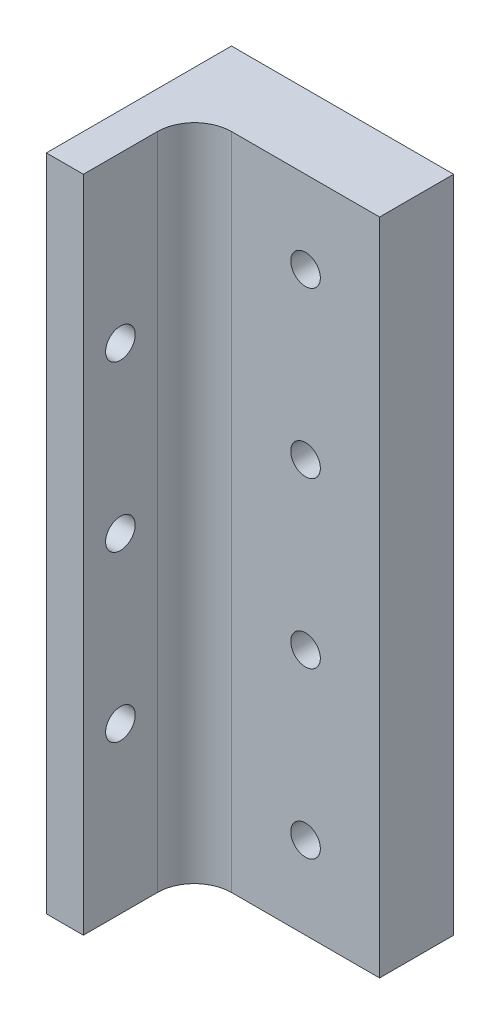
ISO-10303-21;
HEADER;
FILE_DESCRIPTION(('STEP AP214'),'2;1');
FILE_NAME('part.step','',(''),(''),'','','');
FILE_SCHEMA(('AUTOMOTIVE_DESIGN { 1 0 10303 214 1 1 1 1 }'));
ENDSEC;
DATA;
#1=APPLICATION_CONTEXT('core data for automotive mechanical design processes');
#2=APPLICATION_PROTOCOL_DEFINITION('international standard','automotive_design',2000,#1);
#3=PRODUCT_CONTEXT('',#1,'mechanical');
#4=PRODUCT('Part','Part','',(#3));
#5=PRODUCT_RELATED_PRODUCT_CATEGORY('part','',(#4));
#6=PRODUCT_DEFINITION_FORMATION('','',#4);
#7=PRODUCT_DEFINITION_CONTEXT('part definition',#1,'design');
#8=PRODUCT_DEFINITION('design','',#6,#7);
#9=PRODUCT_DEFINITION_SHAPE('','',#8);
#10=(LENGTH_UNIT() NAMED_UNIT(*) SI_UNIT(.MILLI.,.METRE.));
#11=(NAMED_UNIT(*) PLANE_ANGLE_UNIT() SI_UNIT($,.RADIAN.));
#12=(NAMED_UNIT(*) SI_UNIT($,.STERADIAN.) SOLID_ANGLE_UNIT());
#13=UNCERTAINTY_MEASURE_WITH_UNIT(LENGTH_MEASURE(1.E-05),#10,'distance_accuracy_value','');
#14=(GEOMETRIC_REPRESENTATION_CONTEXT(3) GLOBAL_UNCERTAINTY_ASSIGNED_CONTEXT((#13)) GLOBAL_UNIT_ASSIGNED_CONTEXT((#10,
#11,#12)) REPRESENTATION_CONTEXT('',''));
#15=CARTESIAN_POINT('',(0.,0.,0.));
#16=DIRECTION('',(0.,0.,1.));
#17=DIRECTION('',(1.,0.,0.));
#18=AXIS2_PLACEMENT_3D('',#15,#16,#17);
#19=CARTESIAN_POINT('',(0.,0.,10.));
#20=DIRECTION('',(0.,0.,1.));
#21=DIRECTION('',(1.,0.,0.));
#22=AXIS2_PLACEMENT_3D('',#19,#20,#21);
#23=PLANE('',#22);
#24=DIRECTION('',(0.,-1.,0.));
#25=VECTOR('',#24,1.);
#26=CARTESIAN_POINT('',(-55.,-57.,10.));
#27=LINE('',#26,#25);
#28=CARTESIAN_POINT('',(-55.,32.,10.));
#29=VERTEX_POINT('',#28);
#30=CARTESIAN_POINT('',(-55.,-57.,10.));
#31=VERTEX_POINT('',#30);
#32=EDGE_CURVE('E52',#29,#31,#27,.T.);
#33=ORIENTED_EDGE('',*,*,#32,.F.);
#34=DIRECTION('',(1.,0.,0.));
#35=VECTOR('',#34,1.);
#36=CARTESIAN_POINT('',(-55.,32.,10.));
#37=LINE('',#36,#35);
#38=CARTESIAN_POINT('',(-75.,32.,10.));
#39=VERTEX_POINT('',#38);
#40=EDGE_CURVE('E105',#39,#29,#37,.T.);
#41=ORIENTED_EDGE('',*,*,#40,.F.);
#42=DIRECTION('',(0.,1.,0.));
#43=VECTOR('',#42,1.);
#44=CARTESIAN_POINT('',(-75.,0.,10.));
#45=LINE('',#44,#43);
#46=CARTESIAN_POINT('',(-75.,-57.,10.));
#47=VERTEX_POINT('',#46);
#48=EDGE_CURVE('E114',#39,#47,#45,.F.);
#49=ORIENTED_EDGE('',*,*,#48,.T.);
#50=DIRECTION('',(-1.,0.,0.));
#51=VECTOR('',#50,1.);
#52=CARTESIAN_POINT('',(-55.,-57.,10.));
#53=LINE('',#52,#51);
#54=EDGE_CURVE('E116',#31,#47,#53,.T.);
#55=ORIENTED_EDGE('',*,*,#54,.F.);
#56=EDGE_LOOP('',(#33,#41,#49,#55));
#57=FACE_BOUND('',#56,.T.);
#58=CARTESIAN_POINT('',(-65.,20.875,10.));
#59=DIRECTION('',(0.,0.,1.));
#60=DIRECTION('',(1.,0.,0.));
#61=AXIS2_PLACEMENT_3D('',#58,#59,#60);
#62=CIRCLE('',#61,2.);
#63=CARTESIAN_POINT('',(-63.,20.875,10.));
#64=VERTEX_POINT('',#63);
#65=EDGE_CURVE('E203',#64,#64,#62,.T.);
#66=ORIENTED_EDGE('',*,*,#65,.F.);
#67=EDGE_LOOP('',(#66));
#68=FACE_BOUND('',#67,.T.);
#69=CARTESIAN_POINT('',(-65.,-1.375,10.));
#70=DIRECTION('',(0.,0.,1.));
#71=DIRECTION('',(1.,0.,0.));
#72=AXIS2_PLACEMENT_3D('',#69,#70,#71);
#73=CIRCLE('',#72,2.);
#74=CARTESIAN_POINT('',(-63.,-1.375,10.));
#75=VERTEX_POINT('',#74);
#76=EDGE_CURVE('E197',#75,#75,#73,.T.);
#77=ORIENTED_EDGE('',*,*,#76,.F.);
#78=EDGE_LOOP('',(#77));
#79=FACE_BOUND('',#78,.T.);
#80=CARTESIAN_POINT('',(-65.,-23.625,10.));
#81=DIRECTION('',(0.,0.,1.));
#82=DIRECTION('',(1.,0.,0.));
#83=AXIS2_PLACEMENT_3D('',#80,#81,#82);
#84=CIRCLE('',#83,2.);
#85=CARTESIAN_POINT('',(-63.,-23.625,10.));
#86=VERTEX_POINT('',#85);
#87=EDGE_CURVE('E191',#86,#86,#84,.T.);
#88=ORIENTED_EDGE('',*,*,#87,.F.);
#89=EDGE_LOOP('',(#88));
#90=FACE_BOUND('',#89,.T.);
#91=CARTESIAN_POINT('',(-65.,-45.875,10.));
#92=DIRECTION('',(0.,0.,1.));
#93=DIRECTION('',(1.,0.,0.));
#94=AXIS2_PLACEMENT_3D('',#91,#92,#93);
#95=CIRCLE('',#94,2.);
#96=CARTESIAN_POINT('',(-63.,-45.875,10.));
#97=VERTEX_POINT('',#96);
#98=EDGE_CURVE('E185',#97,#97,#95,.T.);
#99=ORIENTED_EDGE('',*,*,#98,.F.);
#100=EDGE_LOOP('',(#99));
#101=FACE_BOUND('',#100,.T.);
#102=ADVANCED_FACE('F37',(#57,#68,#79,#90,#101),#23,.T.);
#103=CARTESIAN_POINT('',(0.,0.,0.));
#104=DIRECTION('',(0.,0.,1.));
#105=DIRECTION('',(1.,0.,0.));
#106=AXIS2_PLACEMENT_3D('',#103,#104,#105);
#107=PLANE('',#106);
#108=CARTESIAN_POINT('',(-65.,20.875,0.));
#109=DIRECTION('',(0.,0.,1.));
#110=DIRECTION('',(1.,0.,0.));
#111=AXIS2_PLACEMENT_3D('',#108,#109,#110);
#112=CIRCLE('',#111,2.);
#113=CARTESIAN_POINT('',(-63.,20.875,0.));
#114=VERTEX_POINT('',#113);
#115=EDGE_CURVE('E171',#114,#114,#112,.T.);
#116=ORIENTED_EDGE('',*,*,#115,.T.);
#117=EDGE_LOOP('',(#116));
#118=FACE_BOUND('',#117,.T.);
#119=CARTESIAN_POINT('',(-65.,-1.375,0.));
#120=DIRECTION('',(0.,0.,1.));
#121=DIRECTION('',(1.,0.,0.));
#122=AXIS2_PLACEMENT_3D('',#119,#120,#121);
#123=CIRCLE('',#122,2.);
#124=CARTESIAN_POINT('',(-63.,-1.375,0.));
#125=VERTEX_POINT('',#124);
#126=EDGE_CURVE('E200',#125,#125,#123,.T.);
#127=ORIENTED_EDGE('',*,*,#126,.T.);
#128=EDGE_LOOP('',(#127));
#129=FACE_BOUND('',#128,.T.);
#130=CARTESIAN_POINT('',(-65.,-23.625,0.));
#131=DIRECTION('',(0.,0.,1.));
#132=DIRECTION('',(1.,0.,0.));
#133=AXIS2_PLACEMENT_3D('',#130,#131,#132);
#134=CIRCLE('',#133,2.);
#135=CARTESIAN_POINT('',(-63.,-23.625,0.));
#136=VERTEX_POINT('',#135);
#137=EDGE_CURVE('E194',#136,#136,#134,.T.);
#138=ORIENTED_EDGE('',*,*,#137,.T.);
#139=EDGE_LOOP('',(#138));
#140=FACE_BOUND('',#139,.T.);
#141=CARTESIAN_POINT('',(-65.,-45.875,0.));
#142=DIRECTION('',(0.,0.,1.));
#143=DIRECTION('',(1.,0.,0.));
#144=AXIS2_PLACEMENT_3D('',#141,#142,#143);
#145=CIRCLE('',#144,2.);
#146=CARTESIAN_POINT('',(-63.,-45.875,0.));
#147=VERTEX_POINT('',#146);
#148=EDGE_CURVE('E188',#147,#147,#145,.T.);
#149=ORIENTED_EDGE('',*,*,#148,.T.);
#150=EDGE_LOOP('',(#149));
#151=FACE_BOUND('',#150,.T.);
#152=DIRECTION('',(-1.,0.,0.));
#153=VECTOR('',#152,1.);
#154=CARTESIAN_POINT('',(-55.,32.,0.));
#155=LINE('',#154,#153);
#156=CARTESIAN_POINT('',(-55.,32.,0.));
#157=VERTEX_POINT('',#156);
#158=CARTESIAN_POINT('',(-85.,32.,0.));
#159=VERTEX_POINT('',#158);
#160=EDGE_CURVE('E103',#157,#159,#155,.T.);
#161=ORIENTED_EDGE('',*,*,#160,.F.);
#162=DIRECTION('',(0.,-1.,0.));
#163=VECTOR('',#162,1.);
#164=CARTESIAN_POINT('',(-55.,-57.,0.));
#165=LINE('',#164,#163);
#166=CARTESIAN_POINT('',(-55.,-57.,0.));
#167=VERTEX_POINT('',#166);
#168=EDGE_CURVE('E93',#157,#167,#165,.T.);
#169=ORIENTED_EDGE('',*,*,#168,.T.);
#170=DIRECTION('',(1.,0.,0.));
#171=VECTOR('',#170,1.);
#172=CARTESIAN_POINT('',(-55.,-57.,0.));
#173=LINE('',#172,#171);
#174=CARTESIAN_POINT('',(-85.,-57.,0.));
#175=VERTEX_POINT('',#174);
#176=EDGE_CURVE('E150',#175,#167,#173,.T.);
#177=ORIENTED_EDGE('',*,*,#176,.F.);
#178=DIRECTION('',(0.,-1.,0.));
#179=VECTOR('',#178,1.);
#180=CARTESIAN_POINT('',(-85.,32.,0.));
#181=LINE('',#180,#179);
#182=EDGE_CURVE('E110',#159,#175,#181,.T.);
#183=ORIENTED_EDGE('',*,*,#182,.F.);
#184=EDGE_LOOP('',(#161,#169,#177,#183));
#185=FACE_BOUND('',#184,.T.);
#186=ADVANCED_FACE('F108',(#118,#129,#140,#151,#185),#107,.F.);
#187=CARTESIAN_POINT('',(0.,32.,0.));
#188=DIRECTION('',(0.,-1.,0.));
#189=DIRECTION('',(0.,0.,-1.));
#190=AXIS2_PLACEMENT_3D('',#187,#188,#189);
#191=PLANE('',#190);
#192=ORIENTED_EDGE('',*,*,#40,.T.);
#193=DIRECTION('',(0.,0.,1.));
#194=VECTOR('',#193,1.);
#195=CARTESIAN_POINT('',(-55.,32.,0.));
#196=LINE('',#195,#194);
#197=EDGE_CURVE('E96',#157,#29,#196,.T.);
#198=ORIENTED_EDGE('',*,*,#197,.F.);
#199=ORIENTED_EDGE('',*,*,#160,.T.);
#200=DIRECTION('',(0.,0.,-1.));
#201=VECTOR('',#200,1.);
#202=CARTESIAN_POINT('',(-85.,32.,0.));
#203=LINE('',#202,#201);
#204=CARTESIAN_POINT('',(-85.,32.,25.));
#205=VERTEX_POINT('',#204);
#206=EDGE_CURVE('E148',#205,#159,#203,.T.);
#207=ORIENTED_EDGE('',*,*,#206,.F.);
#208=DIRECTION('',(-1.,0.,0.));
#209=VECTOR('',#208,1.);
#210=CARTESIAN_POINT('',(-85.,32.,25.));
#211=LINE('',#210,#209);
#212=CARTESIAN_POINT('',(-80.,32.,25.));
#213=VERTEX_POINT('',#212);
#214=EDGE_CURVE('E143',#213,#205,#211,.T.);
#215=ORIENTED_EDGE('',*,*,#214,.F.);
#216=DIRECTION('',(0.,0.,-1.));
#217=VECTOR('',#216,1.);
#218=CARTESIAN_POINT('',(-80.,32.,25.));
#219=LINE('',#218,#217);
#220=CARTESIAN_POINT('',(-80.,32.,15.));
#221=VERTEX_POINT('',#220);
#222=EDGE_CURVE('E139',#213,#221,#219,.T.);
#223=ORIENTED_EDGE('',*,*,#222,.T.);
#224=CARTESIAN_POINT('',(-75.,32.,15.));
#225=DIRECTION('',(0.,-1.,0.));
#226=DIRECTION('',(0.,0.,-1.));
#227=AXIS2_PLACEMENT_3D('',#224,#225,#226);
#228=CIRCLE('',#227,5.);
#229=EDGE_CURVE('E45',#221,#39,#228,.T.);
#230=ORIENTED_EDGE('',*,*,#229,.T.);
#231=EDGE_LOOP('',(#192,#198,#199,#207,#215,#223,#230));
#232=FACE_BOUND('',#231,.T.);
#233=ADVANCED_FACE('F102',(#232),#191,.F.);
#234=CARTESIAN_POINT('',(0.,-57.,0.));
#235=DIRECTION('',(0.,1.,0.));
#236=DIRECTION('',(0.,0.,1.));
#237=AXIS2_PLACEMENT_3D('',#234,#235,#236);
#238=PLANE('',#237);
#239=ORIENTED_EDGE('',*,*,#176,.T.);
#240=DIRECTION('',(0.,0.,1.));
#241=VECTOR('',#240,1.);
#242=CARTESIAN_POINT('',(-55.,-57.,0.));
#243=LINE('',#242,#241);
#244=EDGE_CURVE('E97',#167,#31,#243,.T.);
#245=ORIENTED_EDGE('',*,*,#244,.T.);
#246=ORIENTED_EDGE('',*,*,#54,.T.);
#247=CARTESIAN_POINT('',(-75.,-57.,15.));
#248=DIRECTION('',(0.,1.,0.));
#249=DIRECTION('',(0.,0.,1.));
#250=AXIS2_PLACEMENT_3D('',#247,#248,#249);
#251=CIRCLE('',#250,5.);
#252=CARTESIAN_POINT('',(-80.,-57.,15.));
#253=VERTEX_POINT('',#252);
#254=EDGE_CURVE('E11',#47,#253,#251,.T.);
#255=ORIENTED_EDGE('',*,*,#254,.T.);
#256=DIRECTION('',(0.,0.,-1.));
#257=VECTOR('',#256,1.);
#258=CARTESIAN_POINT('',(-80.,-57.,25.));
#259=LINE('',#258,#257);
#260=CARTESIAN_POINT('',(-80.,-57.,25.));
#261=VERTEX_POINT('',#260);
#262=EDGE_CURVE('E133',#261,#253,#259,.T.);
#263=ORIENTED_EDGE('',*,*,#262,.F.);
#264=DIRECTION('',(1.,0.,0.));
#265=VECTOR('',#264,1.);
#266=CARTESIAN_POINT('',(-85.,-57.,25.));
#267=LINE('',#266,#265);
#268=CARTESIAN_POINT('',(-85.,-57.,25.));
#269=VERTEX_POINT('',#268);
#270=EDGE_CURVE('E152',#269,#261,#267,.T.);
#271=ORIENTED_EDGE('',*,*,#270,.F.);
#272=DIRECTION('',(0.,0.,1.));
#273=VECTOR('',#272,1.);
#274=CARTESIAN_POINT('',(-85.,-57.,0.));
#275=LINE('',#274,#273);
#276=EDGE_CURVE('E141',#175,#269,#275,.T.);
#277=ORIENTED_EDGE('',*,*,#276,.F.);
#278=EDGE_LOOP('',(#239,#245,#246,#255,#263,#271,#277));
#279=FACE_BOUND('',#278,.T.);
#280=ADVANCED_FACE('F131',(#279),#238,.F.);
#281=CARTESIAN_POINT('',(-85.,0.,0.));
#282=DIRECTION('',(-1.,0.,0.));
#283=DIRECTION('',(0.,0.,1.));
#284=AXIS2_PLACEMENT_3D('',#281,#282,#283);
#285=PLANE('',#284);
#286=CARTESIAN_POINT('',(-85.,9.75,20.));
#287=DIRECTION('',(1.,0.,0.));
#288=DIRECTION('',(0.,1.,0.));
#289=AXIS2_PLACEMENT_3D('',#286,#287,#288);
#290=CIRCLE('',#289,2.);
#291=CARTESIAN_POINT('',(-85.,11.75,20.));
#292=VERTEX_POINT('',#291);
#293=EDGE_CURVE('E166',#292,#292,#290,.T.);
#294=ORIENTED_EDGE('',*,*,#293,.T.);
#295=EDGE_LOOP('',(#294));
#296=FACE_BOUND('',#295,.T.);
#297=CARTESIAN_POINT('',(-85.,-12.5,20.));
#298=DIRECTION('',(1.,0.,0.));
#299=DIRECTION('',(0.,1.,0.));
#300=AXIS2_PLACEMENT_3D('',#297,#298,#299);
#301=CIRCLE('',#300,2.);
#302=CARTESIAN_POINT('',(-85.,-10.5,20.));
#303=VERTEX_POINT('',#302);
#304=EDGE_CURVE('E177',#303,#303,#301,.T.);
#305=ORIENTED_EDGE('',*,*,#304,.T.);
#306=EDGE_LOOP('',(#305));
#307=FACE_BOUND('',#306,.T.);
#308=CARTESIAN_POINT('',(-85.,-34.75,20.));
#309=DIRECTION('',(1.,0.,0.));
#310=DIRECTION('',(0.,1.,0.));
#311=AXIS2_PLACEMENT_3D('',#308,#309,#310);
#312=CIRCLE('',#311,2.);
#313=CARTESIAN_POINT('',(-85.,-32.75,20.));
#314=VERTEX_POINT('',#313);
#315=EDGE_CURVE('E170',#314,#314,#312,.T.);
#316=ORIENTED_EDGE('',*,*,#315,.T.);
#317=EDGE_LOOP('',(#316));
#318=FACE_BOUND('',#317,.T.);
#319=ORIENTED_EDGE('',*,*,#182,.T.);
#320=ORIENTED_EDGE('',*,*,#276,.T.);
#321=DIRECTION('',(0.,-1.,0.));
#322=VECTOR('',#321,1.);
#323=CARTESIAN_POINT('',(-85.,32.,25.));
#324=LINE('',#323,#322);
#325=EDGE_CURVE('E157',#205,#269,#324,.T.);
#326=ORIENTED_EDGE('',*,*,#325,.F.);
#327=ORIENTED_EDGE('',*,*,#206,.T.);
#328=EDGE_LOOP('',(#319,#320,#326,#327));
#329=FACE_BOUND('',#328,.T.);
#330=ADVANCED_FACE('F156',(#296,#307,#318,#329),#285,.T.);
#331=CARTESIAN_POINT('',(-80.,32.,25.));
#332=DIRECTION('',(-1.,0.,0.));
#333=DIRECTION('',(0.,-1.,0.));
#334=AXIS2_PLACEMENT_3D('',#331,#332,#333);
#335=PLANE('',#334);
#336=CARTESIAN_POINT('',(-80.,9.75,20.));
#337=DIRECTION('',(1.,0.,0.));
#338=DIRECTION('',(0.,1.,0.));
#339=AXIS2_PLACEMENT_3D('',#336,#337,#338);
#340=CIRCLE('',#339,2.);
#341=CARTESIAN_POINT('',(-80.,11.75,20.));
#342=VERTEX_POINT('',#341);
#343=EDGE_CURVE('E180',#342,#342,#340,.T.);
#344=ORIENTED_EDGE('',*,*,#343,.F.);
#345=EDGE_LOOP('',(#344));
#346=FACE_BOUND('',#345,.T.);
#347=CARTESIAN_POINT('',(-80.,-12.5,20.));
#348=DIRECTION('',(1.,0.,0.));
#349=DIRECTION('',(0.,1.,0.));
#350=AXIS2_PLACEMENT_3D('',#347,#348,#349);
#351=CIRCLE('',#350,2.);
#352=CARTESIAN_POINT('',(-80.,-10.5,20.));
#353=VERTEX_POINT('',#352);
#354=EDGE_CURVE('E174',#353,#353,#351,.T.);
#355=ORIENTED_EDGE('',*,*,#354,.F.);
#356=EDGE_LOOP('',(#355));
#357=FACE_BOUND('',#356,.T.);
#358=CARTESIAN_POINT('',(-80.,-34.75,20.));
#359=DIRECTION('',(1.,0.,0.));
#360=DIRECTION('',(0.,1.,0.));
#361=AXIS2_PLACEMENT_3D('',#358,#359,#360);
#362=CIRCLE('',#361,2.);
#363=CARTESIAN_POINT('',(-80.,-32.75,20.));
#364=VERTEX_POINT('',#363);
#365=EDGE_CURVE('E167',#364,#364,#362,.T.);
#366=ORIENTED_EDGE('',*,*,#365,.F.);
#367=EDGE_LOOP('',(#366));
#368=FACE_BOUND('',#367,.T.);
#369=ORIENTED_EDGE('',*,*,#262,.T.);
#370=DIRECTION('',(0.,1.,0.));
#371=VECTOR('',#370,1.);
#372=CARTESIAN_POINT('',(-80.,32.,15.));
#373=LINE('',#372,#371);
#374=EDGE_CURVE('E111',#253,#221,#373,.T.);
#375=ORIENTED_EDGE('',*,*,#374,.T.);
#376=ORIENTED_EDGE('',*,*,#222,.F.);
#377=DIRECTION('',(0.,1.,0.));
#378=VECTOR('',#377,1.);
#379=CARTESIAN_POINT('',(-80.,32.,25.));
#380=LINE('',#379,#378);
#381=EDGE_CURVE('E138',#261,#213,#380,.T.);
#382=ORIENTED_EDGE('',*,*,#381,.F.);
#383=EDGE_LOOP('',(#369,#375,#376,#382));
#384=FACE_BOUND('',#383,.T.);
#385=ADVANCED_FACE('F136',(#346,#357,#368,#384),#335,.F.);
#386=CARTESIAN_POINT('',(0.,0.,25.));
#387=DIRECTION('',(0.,0.,1.));
#388=DIRECTION('',(1.,0.,0.));
#389=AXIS2_PLACEMENT_3D('',#386,#387,#388);
#390=PLANE('',#389);
#391=ORIENTED_EDGE('',*,*,#325,.T.);
#392=ORIENTED_EDGE('',*,*,#270,.T.);
#393=ORIENTED_EDGE('',*,*,#381,.T.);
#394=ORIENTED_EDGE('',*,*,#214,.T.);
#395=EDGE_LOOP('',(#391,#392,#393,#394));
#396=FACE_BOUND('',#395,.T.);
#397=ADVANCED_FACE('F161',(#396),#390,.T.);
#398=CARTESIAN_POINT('',(-75.,32.,15.));
#399=DIRECTION('',(0.,1.,0.));
#400=DIRECTION('',(-1.,0.,0.));
#401=AXIS2_PLACEMENT_3D('',#398,#399,#400);
#402=CYLINDRICAL_SURFACE('',#401,5.);
#403=ORIENTED_EDGE('',*,*,#254,.F.);
#404=ORIENTED_EDGE('',*,*,#48,.F.);
#405=ORIENTED_EDGE('',*,*,#229,.F.);
#406=ORIENTED_EDGE('',*,*,#374,.F.);
#407=EDGE_LOOP('',(#403,#404,#405,#406));
#408=FACE_BOUND('',#407,.T.);
#409=ADVANCED_FACE('F39',(#408),#402,.F.);
#410=CARTESIAN_POINT('',(-85.,-34.75,20.));
#411=DIRECTION('',(1.,0.,0.));
#412=DIRECTION('',(0.,1.,0.));
#413=AXIS2_PLACEMENT_3D('',#410,#411,#412);
#414=CYLINDRICAL_SURFACE('',#413,2.);
#415=ORIENTED_EDGE('',*,*,#315,.F.);
#416=EDGE_LOOP('',(#415));
#417=FACE_BOUND('',#416,.T.);
#418=ORIENTED_EDGE('',*,*,#365,.T.);
#419=EDGE_LOOP('',(#418));
#420=FACE_BOUND('',#419,.T.);
#421=ADVANCED_FACE('F248',(#417,#420),#414,.F.);
#422=CARTESIAN_POINT('',(-85.,-12.5,20.));
#423=DIRECTION('',(1.,0.,0.));
#424=DIRECTION('',(0.,1.,0.));
#425=AXIS2_PLACEMENT_3D('',#422,#423,#424);
#426=CYLINDRICAL_SURFACE('',#425,2.);
#427=ORIENTED_EDGE('',*,*,#304,.F.);
#428=EDGE_LOOP('',(#427));
#429=FACE_BOUND('',#428,.T.);
#430=ORIENTED_EDGE('',*,*,#354,.T.);
#431=EDGE_LOOP('',(#430));
#432=FACE_BOUND('',#431,.T.);
#433=ADVANCED_FACE('F240',(#429,#432),#426,.F.);
#434=CARTESIAN_POINT('',(-85.,9.75,20.));
#435=DIRECTION('',(1.,0.,0.));
#436=DIRECTION('',(0.,1.,0.));
#437=AXIS2_PLACEMENT_3D('',#434,#435,#436);
#438=CYLINDRICAL_SURFACE('',#437,2.);
#439=ORIENTED_EDGE('',*,*,#293,.F.);
#440=EDGE_LOOP('',(#439));
#441=FACE_BOUND('',#440,.T.);
#442=ORIENTED_EDGE('',*,*,#343,.T.);
#443=EDGE_LOOP('',(#442));
#444=FACE_BOUND('',#443,.T.);
#445=ADVANCED_FACE('F231',(#441,#444),#438,.F.);
#446=CARTESIAN_POINT('',(-65.,-45.875,0.));
#447=DIRECTION('',(0.,0.,1.));
#448=DIRECTION('',(1.,0.,0.));
#449=AXIS2_PLACEMENT_3D('',#446,#447,#448);
#450=CYLINDRICAL_SURFACE('',#449,2.);
#451=ORIENTED_EDGE('',*,*,#148,.F.);
#452=EDGE_LOOP('',(#451));
#453=FACE_BOUND('',#452,.T.);
#454=ORIENTED_EDGE('',*,*,#98,.T.);
#455=EDGE_LOOP('',(#454));
#456=FACE_BOUND('',#455,.T.);
#457=ADVANCED_FACE('F228',(#453,#456),#450,.F.);
#458=CARTESIAN_POINT('',(-65.,-23.625,0.));
#459=DIRECTION('',(0.,0.,1.));
#460=DIRECTION('',(1.,0.,0.));
#461=AXIS2_PLACEMENT_3D('',#458,#459,#460);
#462=CYLINDRICAL_SURFACE('',#461,2.);
#463=ORIENTED_EDGE('',*,*,#137,.F.);
#464=EDGE_LOOP('',(#463));
#465=FACE_BOUND('',#464,.T.);
#466=ORIENTED_EDGE('',*,*,#87,.T.);
#467=EDGE_LOOP('',(#466));
#468=FACE_BOUND('',#467,.T.);
#469=ADVANCED_FACE('F230',(#465,#468),#462,.F.);
#470=CARTESIAN_POINT('',(-65.,-1.375,0.));
#471=DIRECTION('',(0.,0.,1.));
#472=DIRECTION('',(1.,0.,0.));
#473=AXIS2_PLACEMENT_3D('',#470,#471,#472);
#474=CYLINDRICAL_SURFACE('',#473,2.);
#475=ORIENTED_EDGE('',*,*,#126,.F.);
#476=EDGE_LOOP('',(#475));
#477=FACE_BOUND('',#476,.T.);
#478=ORIENTED_EDGE('',*,*,#76,.T.);
#479=EDGE_LOOP('',(#478));
#480=FACE_BOUND('',#479,.T.);
#481=ADVANCED_FACE('F216',(#477,#480),#474,.F.);
#482=CARTESIAN_POINT('',(-65.,20.875,0.));
#483=DIRECTION('',(0.,0.,1.));
#484=DIRECTION('',(1.,0.,0.));
#485=AXIS2_PLACEMENT_3D('',#482,#483,#484);
#486=CYLINDRICAL_SURFACE('',#485,2.);
#487=ORIENTED_EDGE('',*,*,#115,.F.);
#488=EDGE_LOOP('',(#487));
#489=FACE_BOUND('',#488,.T.);
#490=ORIENTED_EDGE('',*,*,#65,.T.);
#491=EDGE_LOOP('',(#490));
#492=FACE_BOUND('',#491,.T.);
#493=ADVANCED_FACE('F213',(#489,#492),#486,.F.);
#494=CARTESIAN_POINT('',(-55.,-57.,0.));
#495=DIRECTION('',(-1.,0.,0.));
#496=DIRECTION('',(0.,0.,1.));
#497=AXIS2_PLACEMENT_3D('',#494,#495,#496);
#498=PLANE('',#497);
#499=ORIENTED_EDGE('',*,*,#32,.T.);
#500=ORIENTED_EDGE('',*,*,#244,.F.);
#501=ORIENTED_EDGE('',*,*,#168,.F.);
#502=ORIENTED_EDGE('',*,*,#197,.T.);
#503=EDGE_LOOP('',(#499,#500,#501,#502));
#504=FACE_BOUND('',#503,.T.);
#505=ADVANCED_FACE('F95',(#504),#498,.F.);
#506=CLOSED_SHELL('',(#102,#186,#233,#280,#330,#385,#397,#409,#421,#433,#445,#457,#469,#481,
#493,#505));
#507=MANIFOLD_SOLID_BREP('B2',#506);
#508=ADVANCED_BREP_SHAPE_REPRESENTATION('',(#18,#507),#14);
#509=SHAPE_DEFINITION_REPRESENTATION(#9,#508);
ENDSEC;
END-ISO-10303-21;
